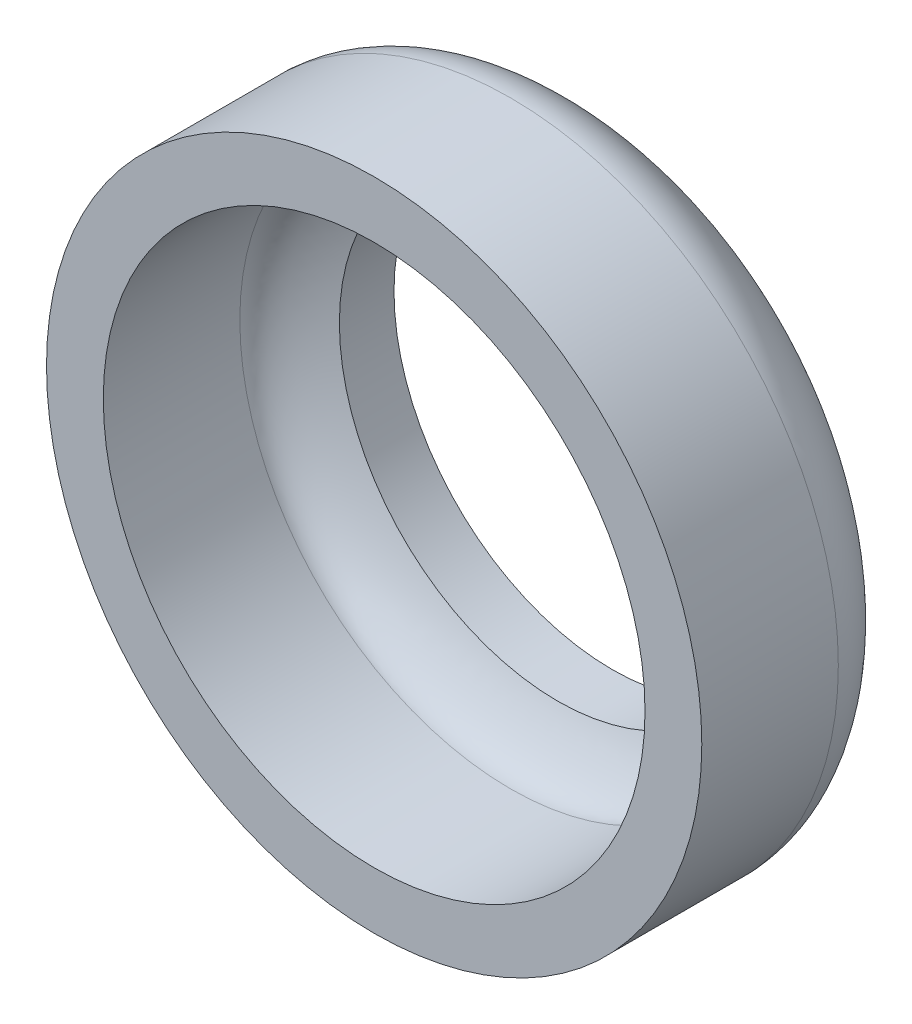
ISO-10303-21;
HEADER;
FILE_DESCRIPTION(('STEP AP214'),'2;1');
FILE_NAME('part.step','',(''),(''),'','','');
FILE_SCHEMA(('AUTOMOTIVE_DESIGN { 1 0 10303 214 1 1 1 1 }'));
ENDSEC;
DATA;
#1=APPLICATION_CONTEXT('core data for automotive mechanical design processes');
#2=APPLICATION_PROTOCOL_DEFINITION('international standard','automotive_design',2000,#1);
#3=PRODUCT_CONTEXT('',#1,'mechanical');
#4=PRODUCT('Part','Part','',(#3));
#5=PRODUCT_RELATED_PRODUCT_CATEGORY('part','',(#4));
#6=PRODUCT_DEFINITION_FORMATION('','',#4);
#7=PRODUCT_DEFINITION_CONTEXT('part definition',#1,'design');
#8=PRODUCT_DEFINITION('design','',#6,#7);
#9=PRODUCT_DEFINITION_SHAPE('','',#8);
#10=(LENGTH_UNIT() NAMED_UNIT(*) SI_UNIT(.MILLI.,.METRE.));
#11=(NAMED_UNIT(*) PLANE_ANGLE_UNIT() SI_UNIT($,.RADIAN.));
#12=(NAMED_UNIT(*) SI_UNIT($,.STERADIAN.) SOLID_ANGLE_UNIT());
#13=UNCERTAINTY_MEASURE_WITH_UNIT(LENGTH_MEASURE(1.E-05),#10,'distance_accuracy_value','');
#14=(GEOMETRIC_REPRESENTATION_CONTEXT(3) GLOBAL_UNCERTAINTY_ASSIGNED_CONTEXT((#13)) GLOBAL_UNIT_ASSIGNED_CONTEXT((#10,
#11,#12)) REPRESENTATION_CONTEXT('',''));
#15=CARTESIAN_POINT('',(0.,0.,0.));
#16=DIRECTION('',(0.,0.,1.));
#17=DIRECTION('',(1.,0.,0.));
#18=AXIS2_PLACEMENT_3D('',#15,#16,#17);
#19=CARTESIAN_POINT('',(0.,9.525,0.));
#20=DIRECTION('',(0.,0.,-1.));
#21=DIRECTION('',(-1.,0.,0.));
#22=AXIS2_PLACEMENT_3D('',#19,#20,#21);
#23=PLANE('',#22);
#24=CARTESIAN_POINT('',(0.,0.,0.));
#25=DIRECTION('',(0.,0.,1.));
#26=DIRECTION('',(1.,0.,0.));
#27=AXIS2_PLACEMENT_3D('',#24,#25,#26);
#28=CIRCLE('',#27,7.874);
#29=CARTESIAN_POINT('',(7.874,0.,0.));
#30=VERTEX_POINT('',#29);
#31=EDGE_CURVE('E10',#30,#30,#28,.T.);
#32=ORIENTED_EDGE('',*,*,#31,.F.);
#33=EDGE_LOOP('',(#32));
#34=FACE_BOUND('',#33,.T.);
#35=CARTESIAN_POINT('',(0.,0.,0.));
#36=DIRECTION('',(0.,0.,1.));
#37=DIRECTION('',(1.,0.,0.));
#38=AXIS2_PLACEMENT_3D('',#35,#36,#37);
#39=CIRCLE('',#38,9.525);
#40=CARTESIAN_POINT('',(9.525,0.,0.));
#41=VERTEX_POINT('',#40);
#42=EDGE_CURVE('E58',#41,#41,#39,.T.);
#43=ORIENTED_EDGE('',*,*,#42,.T.);
#44=EDGE_LOOP('',(#43));
#45=FACE_BOUND('',#44,.T.);
#46=ADVANCED_FACE('F39',(#34,#45),#23,.F.);
#47=CARTESIAN_POINT('',(0.,0.,0.));
#48=DIRECTION('',(0.,0.,1.));
#49=DIRECTION('',(1.,0.,0.));
#50=AXIS2_PLACEMENT_3D('',#47,#48,#49);
#51=CYLINDRICAL_SURFACE('',#50,7.874);
#52=CARTESIAN_POINT('',(0.,0.,-3.96875));
#53=DIRECTION('',(0.,0.,1.));
#54=DIRECTION('',(1.,0.,0.));
#55=AXIS2_PLACEMENT_3D('',#52,#53,#54);
#56=CIRCLE('',#55,7.874);
#57=CARTESIAN_POINT('',(7.874,0.,-3.96875));
#58=VERTEX_POINT('',#57);
#59=EDGE_CURVE('E47',#58,#58,#56,.T.);
#60=ORIENTED_EDGE('',*,*,#59,.F.);
#61=EDGE_LOOP('',(#60));
#62=FACE_BOUND('',#61,.T.);
#63=ORIENTED_EDGE('',*,*,#31,.T.);
#64=EDGE_LOOP('',(#63));
#65=FACE_BOUND('',#64,.T.);
#66=ADVANCED_FACE('F77',(#62,#65),#51,.F.);
#67=CARTESIAN_POINT('',(0.,0.,-3.96875));
#68=DIRECTION('',(-1.,0.,0.));
#69=DIRECTION('',(0.,1.,0.));
#70=AXIS2_PLACEMENT_3D('',#67,#68,#69);
#71=ELLIPSE('',#70,7.874,2.31775);
#72=TRIMMED_CURVE('',#71,(PARAMETER_VALUE(-1.5707963267949)),(PARAMETER_VALUE(1.5707963267949)),
.T.,.PARAMETER.);
#73=CARTESIAN_POINT('',(0.,0.,0.));
#74=DIRECTION('',(0.,0.,1.));
#75=AXIS1_PLACEMENT('',#73,#74);
#76=SURFACE_OF_REVOLUTION('',#72,#75);
#77=CARTESIAN_POINT('',(0.,0.,-5.33923578283663));
#78=DIRECTION('',(0.,0.,1.));
#79=DIRECTION('',(1.,0.,0.));
#80=AXIS2_PLACEMENT_3D('',#77,#78,#79);
#81=CIRCLE('',#80,6.35);
#82=CARTESIAN_POINT('',(6.35,0.,-5.33923578283663));
#83=VERTEX_POINT('',#82);
#84=EDGE_CURVE('E62',#83,#83,#81,.F.);
#85=ORIENTED_EDGE('',*,*,#84,.T.);
#86=EDGE_LOOP('',(#85));
#87=FACE_BOUND('',#86,.T.);
#88=ORIENTED_EDGE('',*,*,#59,.T.);
#89=EDGE_LOOP('',(#88));
#90=FACE_BOUND('',#89,.T.);
#91=ADVANCED_FACE('F73',(#87,#90),#76,.T.);
#92=CARTESIAN_POINT('',(0.,0.,-3.96875));
#93=DIRECTION('',(1.,0.,0.));
#94=DIRECTION('',(0.,1.,0.));
#95=AXIS2_PLACEMENT_3D('',#92,#93,#94);
#96=ELLIPSE('',#95,9.525,3.96875);
#97=TRIMMED_CURVE('',#96,(PARAMETER_VALUE(4.71238898038469)),
(PARAMETER_VALUE(7.85398163397448)),.T.,.PARAMETER.);
#98=CARTESIAN_POINT('',(0.,0.,0.));
#99=DIRECTION('',(0.,0.,1.));
#100=AXIS1_PLACEMENT('',#98,#99);
#101=SURFACE_OF_REVOLUTION('',#97,#100);
#102=CARTESIAN_POINT('',(0.,0.,-6.9268815952341));
#103=DIRECTION('',(0.,0.,1.));
#104=DIRECTION('',(1.,0.,0.));
#105=AXIS2_PLACEMENT_3D('',#102,#103,#104);
#106=CIRCLE('',#105,6.35);
#107=CARTESIAN_POINT('',(6.35,0.,-6.9268815952341));
#108=VERTEX_POINT('',#107);
#109=EDGE_CURVE('E42',#108,#108,#106,.T.);
#110=ORIENTED_EDGE('',*,*,#109,.T.);
#111=EDGE_LOOP('',(#110));
#112=FACE_BOUND('',#111,.T.);
#113=CARTESIAN_POINT('',(0.,0.,-3.96875));
#114=DIRECTION('',(0.,0.,1.));
#115=DIRECTION('',(1.,0.,0.));
#116=AXIS2_PLACEMENT_3D('',#113,#114,#115);
#117=CIRCLE('',#116,9.525);
#118=CARTESIAN_POINT('',(9.525,0.,-3.96875));
#119=VERTEX_POINT('',#118);
#120=EDGE_CURVE('E52',#119,#119,#117,.T.);
#121=ORIENTED_EDGE('',*,*,#120,.F.);
#122=EDGE_LOOP('',(#121));
#123=FACE_BOUND('',#122,.T.);
#124=ADVANCED_FACE('F68',(#112,#123),#101,.T.);
#125=CARTESIAN_POINT('',(0.,0.,0.));
#126=DIRECTION('',(0.,0.,1.));
#127=DIRECTION('',(1.,0.,0.));
#128=AXIS2_PLACEMENT_3D('',#125,#126,#127);
#129=CYLINDRICAL_SURFACE('',#128,9.525);
#130=ORIENTED_EDGE('',*,*,#42,.F.);
#131=EDGE_LOOP('',(#130));
#132=FACE_BOUND('',#131,.T.);
#133=ORIENTED_EDGE('',*,*,#120,.T.);
#134=EDGE_LOOP('',(#133));
#135=FACE_BOUND('',#134,.T.);
#136=ADVANCED_FACE('F72',(#132,#135),#129,.T.);
#137=CARTESIAN_POINT('',(0.,0.,-7.9375));
#138=DIRECTION('',(0.,0.,1.));
#139=DIRECTION('',(1.,0.,0.));
#140=AXIS2_PLACEMENT_3D('',#137,#138,#139);
#141=CYLINDRICAL_SURFACE('',#140,6.35);
#142=ORIENTED_EDGE('',*,*,#109,.F.);
#143=EDGE_LOOP('',(#142));
#144=FACE_BOUND('',#143,.T.);
#145=ORIENTED_EDGE('',*,*,#84,.F.);
#146=EDGE_LOOP('',(#145));
#147=FACE_BOUND('',#146,.T.);
#148=ADVANCED_FACE('F94',(#144,#147),#141,.F.);
#149=CLOSED_SHELL('',(#46,#66,#91,#124,#136,#148));
#150=MANIFOLD_SOLID_BREP('B2',#149);
#151=ADVANCED_BREP_SHAPE_REPRESENTATION('',(#18,#150),#14);
#152=SHAPE_DEFINITION_REPRESENTATION(#9,#151);
ENDSEC;
END-ISO-10303-21;
